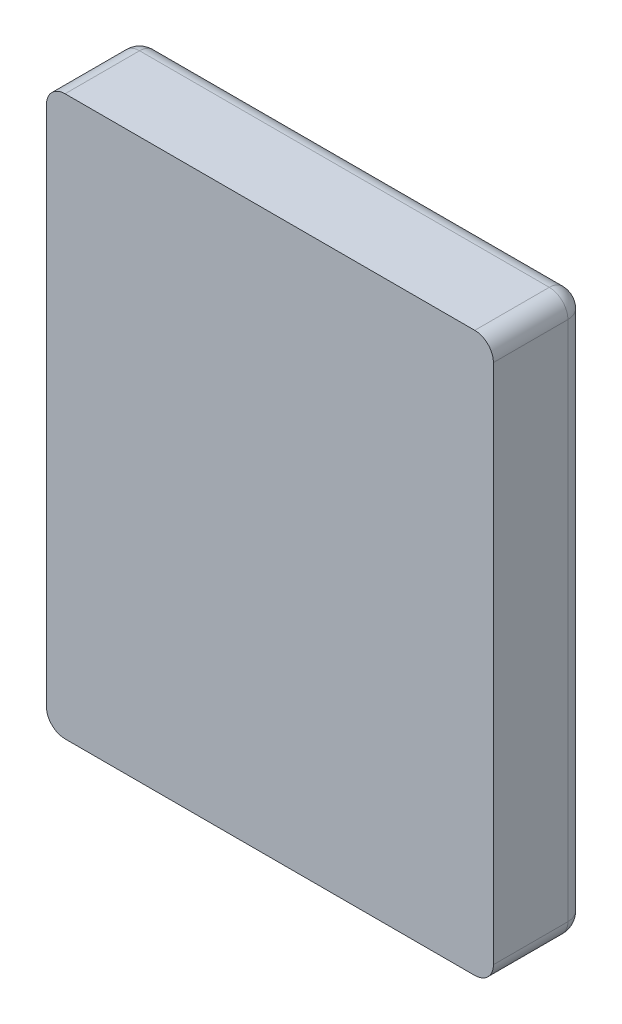
ISO-10303-21;
HEADER;
FILE_DESCRIPTION(('STEP AP214'),'2;1');
FILE_NAME('part.step','',(''),(''),'','','');
FILE_SCHEMA(('AUTOMOTIVE_DESIGN { 1 0 10303 214 1 1 1 1 }'));
ENDSEC;
DATA;
#1=APPLICATION_CONTEXT('core data for automotive mechanical design processes');
#2=APPLICATION_PROTOCOL_DEFINITION('international standard','automotive_design',2000,#1);
#3=PRODUCT_CONTEXT('',#1,'mechanical');
#4=PRODUCT('Part','Part','',(#3));
#5=PRODUCT_RELATED_PRODUCT_CATEGORY('part','',(#4));
#6=PRODUCT_DEFINITION_FORMATION('','',#4);
#7=PRODUCT_DEFINITION_CONTEXT('part definition',#1,'design');
#8=PRODUCT_DEFINITION('design','',#6,#7);
#9=PRODUCT_DEFINITION_SHAPE('','',#8);
#10=(LENGTH_UNIT() NAMED_UNIT(*) SI_UNIT(.MILLI.,.METRE.));
#11=(NAMED_UNIT(*) PLANE_ANGLE_UNIT() SI_UNIT($,.RADIAN.));
#12=(NAMED_UNIT(*) SI_UNIT($,.STERADIAN.) SOLID_ANGLE_UNIT());
#13=UNCERTAINTY_MEASURE_WITH_UNIT(LENGTH_MEASURE(1.E-05),#10,'distance_accuracy_value','');
#14=(GEOMETRIC_REPRESENTATION_CONTEXT(3) GLOBAL_UNCERTAINTY_ASSIGNED_CONTEXT((#13)) GLOBAL_UNIT_ASSIGNED_CONTEXT((#10,
#11,#12)) REPRESENTATION_CONTEXT('',''));
#15=CARTESIAN_POINT('',(0.,0.,0.));
#16=DIRECTION('',(0.,0.,1.));
#17=DIRECTION('',(1.,0.,0.));
#18=AXIS2_PLACEMENT_3D('',#15,#16,#17);
#19=CARTESIAN_POINT('',(-4.7,19.2,-2.));
#20=DIRECTION('',(1.,0.,0.));
#21=DIRECTION('',(0.,1.,0.));
#22=AXIS2_PLACEMENT_3D('',#19,#20,#21);
#23=SPHERICAL_SURFACE('',#22,0.5);
#24=CARTESIAN_POINT('',(-4.7,19.2,-2.));
#25=DIRECTION('',(1.,0.,0.));
#26=DIRECTION('',(0.,1.,0.));
#27=AXIS2_PLACEMENT_3D('',#24,#25,#26);
#28=CIRCLE('',#27,0.5);
#29=CARTESIAN_POINT('',(-4.7,19.2,-2.5));
#30=VERTEX_POINT('',#29);
#31=CARTESIAN_POINT('',(-4.7,19.7,-2.));
#32=VERTEX_POINT('',#31);
#33=EDGE_CURVE('E104',#30,#32,#28,.T.);
#34=ORIENTED_EDGE('',*,*,#33,.F.);
#35=CARTESIAN_POINT('',(-4.7,19.2,-2.));
#36=DIRECTION('',(0.,1.,0.));
#37=DIRECTION('',(-1.,0.,0.));
#38=AXIS2_PLACEMENT_3D('',#35,#36,#37);
#39=CIRCLE('',#38,0.5);
#40=CARTESIAN_POINT('',(-5.2,19.2,-2.));
#41=VERTEX_POINT('',#40);
#42=EDGE_CURVE('E106',#41,#30,#39,.F.);
#43=ORIENTED_EDGE('',*,*,#42,.F.);
#44=CARTESIAN_POINT('',(-4.7,19.2,-2.));
#45=DIRECTION('',(0.,0.,1.));
#46=DIRECTION('',(1.,0.,0.));
#47=AXIS2_PLACEMENT_3D('',#44,#45,#46);
#48=CIRCLE('',#47,0.5);
#49=EDGE_CURVE('E108',#32,#41,#48,.T.);
#50=ORIENTED_EDGE('',*,*,#49,.F.);
#51=EDGE_LOOP('',(#34,#43,#50));
#52=FACE_BOUND('',#51,.T.);
#53=ADVANCED_FACE('F17',(#52),#23,.T.);
#54=CARTESIAN_POINT('',(-4.7,5.2,-2.));
#55=DIRECTION('',(1.,0.,0.));
#56=DIRECTION('',(0.,1.,0.));
#57=AXIS2_PLACEMENT_3D('',#54,#55,#56);
#58=SPHERICAL_SURFACE('',#57,0.5);
#59=CARTESIAN_POINT('',(-4.69999999999999,5.2,-2.));
#60=DIRECTION('',(0.,1.,0.));
#61=DIRECTION('',(-1.,0.,0.));
#62=AXIS2_PLACEMENT_3D('',#59,#60,#61);
#63=CIRCLE('',#62,0.5);
#64=CARTESIAN_POINT('',(-4.7,5.2,-2.5));
#65=VERTEX_POINT('',#64);
#66=CARTESIAN_POINT('',(-5.2,5.2,-2.));
#67=VERTEX_POINT('',#66);
#68=EDGE_CURVE('E133',#65,#67,#63,.T.);
#69=ORIENTED_EDGE('',*,*,#68,.F.);
#70=CARTESIAN_POINT('',(-4.7,5.2,-2.));
#71=DIRECTION('',(-1.,0.,0.));
#72=DIRECTION('',(0.,-1.,0.));
#73=AXIS2_PLACEMENT_3D('',#70,#71,#72);
#74=CIRCLE('',#73,0.5);
#75=CARTESIAN_POINT('',(-4.7,4.7,-2.));
#76=VERTEX_POINT('',#75);
#77=EDGE_CURVE('E156',#76,#65,#74,.F.);
#78=ORIENTED_EDGE('',*,*,#77,.F.);
#79=CARTESIAN_POINT('',(-4.7,5.2,-2.));
#80=DIRECTION('',(0.,0.,1.));
#81=DIRECTION('',(1.,0.,0.));
#82=AXIS2_PLACEMENT_3D('',#79,#80,#81);
#83=CIRCLE('',#82,0.5);
#84=EDGE_CURVE('E150',#67,#76,#83,.T.);
#85=ORIENTED_EDGE('',*,*,#84,.F.);
#86=EDGE_LOOP('',(#69,#78,#85));
#87=FACE_BOUND('',#86,.T.);
#88=ADVANCED_FACE('F194',(#87),#58,.T.);
#89=CARTESIAN_POINT('',(6.3,5.2,-2.));
#90=DIRECTION('',(1.,0.,0.));
#91=DIRECTION('',(0.,1.,0.));
#92=AXIS2_PLACEMENT_3D('',#89,#90,#91);
#93=SPHERICAL_SURFACE('',#92,0.5);
#94=CARTESIAN_POINT('',(6.3,5.2,-2.));
#95=DIRECTION('',(0.,0.,1.));
#96=DIRECTION('',(1.,0.,0.));
#97=AXIS2_PLACEMENT_3D('',#94,#95,#96);
#98=CIRCLE('',#97,0.5);
#99=CARTESIAN_POINT('',(6.3,4.7,-2.));
#100=VERTEX_POINT('',#99);
#101=CARTESIAN_POINT('',(6.8,5.2,-2.));
#102=VERTEX_POINT('',#101);
#103=EDGE_CURVE('E147',#100,#102,#98,.T.);
#104=ORIENTED_EDGE('',*,*,#103,.F.);
#105=CARTESIAN_POINT('',(6.3,5.2,-2.));
#106=DIRECTION('',(-1.,0.,0.));
#107=DIRECTION('',(0.,-1.,0.));
#108=AXIS2_PLACEMENT_3D('',#105,#106,#107);
#109=CIRCLE('',#108,0.5);
#110=CARTESIAN_POINT('',(6.3,5.2,-2.5));
#111=VERTEX_POINT('',#110);
#112=EDGE_CURVE('E148',#111,#100,#109,.T.);
#113=ORIENTED_EDGE('',*,*,#112,.F.);
#114=CARTESIAN_POINT('',(6.3,5.2,-2.));
#115=DIRECTION('',(0.,-1.,0.));
#116=DIRECTION('',(1.,0.,0.));
#117=AXIS2_PLACEMENT_3D('',#114,#115,#116);
#118=CIRCLE('',#117,0.5);
#119=EDGE_CURVE('E206',#102,#111,#118,.F.);
#120=ORIENTED_EDGE('',*,*,#119,.F.);
#121=EDGE_LOOP('',(#104,#113,#120));
#122=FACE_BOUND('',#121,.T.);
#123=ADVANCED_FACE('F192',(#122),#93,.T.);
#124=CARTESIAN_POINT('',(0.,0.,-2.5));
#125=DIRECTION('',(0.,0.,1.));
#126=DIRECTION('',(1.,0.,0.));
#127=AXIS2_PLACEMENT_3D('',#124,#125,#126);
#128=PLANE('',#127);
#129=DIRECTION('',(-1.,0.,0.));
#130=VECTOR('',#129,1.);
#131=CARTESIAN_POINT('',(-5.2,5.2,-2.5));
#132=LINE('',#131,#130);
#133=EDGE_CURVE('E132',#65,#111,#132,.F.);
#134=ORIENTED_EDGE('',*,*,#133,.F.);
#135=DIRECTION('',(0.,1.,0.));
#136=VECTOR('',#135,1.);
#137=CARTESIAN_POINT('',(-4.7,19.7,-2.5));
#138=LINE('',#137,#136);
#139=EDGE_CURVE('E120',#30,#65,#138,.F.);
#140=ORIENTED_EDGE('',*,*,#139,.F.);
#141=DIRECTION('',(1.,0.,0.));
#142=VECTOR('',#141,1.);
#143=CARTESIAN_POINT('',(6.8,19.2,-2.5));
#144=LINE('',#143,#142);
#145=CARTESIAN_POINT('',(6.3,19.2,-2.5));
#146=VERTEX_POINT('',#145);
#147=EDGE_CURVE('E129',#146,#30,#144,.F.);
#148=ORIENTED_EDGE('',*,*,#147,.F.);
#149=DIRECTION('',(0.,-1.,0.));
#150=VECTOR('',#149,1.);
#151=CARTESIAN_POINT('',(6.3,4.7,-2.5));
#152=LINE('',#151,#150);
#153=EDGE_CURVE('E145',#111,#146,#152,.F.);
#154=ORIENTED_EDGE('',*,*,#153,.F.);
#155=EDGE_LOOP('',(#134,#140,#148,#154));
#156=FACE_BOUND('',#155,.T.);
#157=ADVANCED_FACE('F127',(#156),#128,.F.);
#158=CARTESIAN_POINT('',(6.3,19.2,-2.));
#159=DIRECTION('',(1.,0.,0.));
#160=DIRECTION('',(0.,1.,0.));
#161=AXIS2_PLACEMENT_3D('',#158,#159,#160);
#162=SPHERICAL_SURFACE('',#161,0.5);
#163=CARTESIAN_POINT('',(6.3,19.2,-2.));
#164=DIRECTION('',(0.,0.,1.));
#165=DIRECTION('',(1.,0.,0.));
#166=AXIS2_PLACEMENT_3D('',#163,#164,#165);
#167=CIRCLE('',#166,0.5);
#168=CARTESIAN_POINT('',(6.8,19.2,-2.));
#169=VERTEX_POINT('',#168);
#170=CARTESIAN_POINT('',(6.3,19.7,-2.));
#171=VERTEX_POINT('',#170);
#172=EDGE_CURVE('E70',#169,#171,#167,.T.);
#173=ORIENTED_EDGE('',*,*,#172,.F.);
#174=CARTESIAN_POINT('',(6.3,19.2,-2.));
#175=DIRECTION('',(0.,-1.,0.));
#176=DIRECTION('',(1.,0.,0.));
#177=AXIS2_PLACEMENT_3D('',#174,#175,#176);
#178=CIRCLE('',#177,0.5);
#179=EDGE_CURVE('E209',#146,#169,#178,.T.);
#180=ORIENTED_EDGE('',*,*,#179,.F.);
#181=CARTESIAN_POINT('',(6.3,19.2,-2.));
#182=DIRECTION('',(1.,0.,0.));
#183=DIRECTION('',(0.,1.,0.));
#184=AXIS2_PLACEMENT_3D('',#181,#182,#183);
#185=CIRCLE('',#184,0.5);
#186=EDGE_CURVE('E112',#171,#146,#185,.F.);
#187=ORIENTED_EDGE('',*,*,#186,.F.);
#188=EDGE_LOOP('',(#173,#180,#187));
#189=FACE_BOUND('',#188,.T.);
#190=ADVANCED_FACE('F185',(#189),#162,.T.);
#191=CARTESIAN_POINT('',(6.8,19.2,-2.));
#192=DIRECTION('',(1.,0.,0.));
#193=DIRECTION('',(0.,1.,0.));
#194=AXIS2_PLACEMENT_3D('',#191,#192,#193);
#195=CYLINDRICAL_SURFACE('',#194,0.5);
#196=ORIENTED_EDGE('',*,*,#186,.T.);
#197=ORIENTED_EDGE('',*,*,#147,.T.);
#198=ORIENTED_EDGE('',*,*,#33,.T.);
#199=DIRECTION('',(-1.,0.,0.));
#200=VECTOR('',#199,1.);
#201=CARTESIAN_POINT('',(6.8,19.7,-2.));
#202=LINE('',#201,#200);
#203=EDGE_CURVE('E170',#171,#32,#202,.T.);
#204=ORIENTED_EDGE('',*,*,#203,.F.);
#205=EDGE_LOOP('',(#196,#197,#198,#204));
#206=FACE_BOUND('',#205,.T.);
#207=ADVANCED_FACE('F136',(#206),#195,.T.);
#208=CARTESIAN_POINT('',(-4.7,19.2,-2.5));
#209=DIRECTION('',(0.,0.,1.));
#210=DIRECTION('',(1.,0.,0.));
#211=AXIS2_PLACEMENT_3D('',#208,#209,#210);
#212=CYLINDRICAL_SURFACE('',#211,0.5);
#213=ORIENTED_EDGE('',*,*,#49,.T.);
#214=DIRECTION('',(0.,0.,1.));
#215=VECTOR('',#214,1.);
#216=CARTESIAN_POINT('',(-5.2,19.2,-2.5));
#217=LINE('',#216,#215);
#218=CARTESIAN_POINT('',(-5.2,19.2,0.));
#219=VERTEX_POINT('',#218);
#220=EDGE_CURVE('E239',#219,#41,#217,.F.);
#221=ORIENTED_EDGE('',*,*,#220,.F.);
#222=CARTESIAN_POINT('',(-4.7,19.2,0.));
#223=DIRECTION('',(0.,0.,1.));
#224=DIRECTION('',(1.,0.,0.));
#225=AXIS2_PLACEMENT_3D('',#222,#223,#224);
#226=CIRCLE('',#225,0.5);
#227=CARTESIAN_POINT('',(-4.7,19.7,0.));
#228=VERTEX_POINT('',#227);
#229=EDGE_CURVE('E21',#219,#228,#226,.F.);
#230=ORIENTED_EDGE('',*,*,#229,.T.);
#231=DIRECTION('',(0.,0.,1.));
#232=VECTOR('',#231,1.);
#233=CARTESIAN_POINT('',(-4.7,19.7,-2.5));
#234=LINE('',#233,#232);
#235=EDGE_CURVE('E173',#32,#228,#234,.T.);
#236=ORIENTED_EDGE('',*,*,#235,.F.);
#237=EDGE_LOOP('',(#213,#221,#230,#236));
#238=FACE_BOUND('',#237,.T.);
#239=ADVANCED_FACE('F304',(#238),#212,.T.);
#240=CARTESIAN_POINT('',(-4.7,19.7,-2.));
#241=DIRECTION('',(0.,1.,0.));
#242=DIRECTION('',(-1.,0.,0.));
#243=AXIS2_PLACEMENT_3D('',#240,#241,#242);
#244=CYLINDRICAL_SURFACE('',#243,0.5);
#245=ORIENTED_EDGE('',*,*,#68,.T.);
#246=DIRECTION('',(0.,-1.,0.));
#247=VECTOR('',#246,1.);
#248=CARTESIAN_POINT('',(-5.2,19.7,-2.));
#249=LINE('',#248,#247);
#250=EDGE_CURVE('E122',#41,#67,#249,.T.);
#251=ORIENTED_EDGE('',*,*,#250,.F.);
#252=ORIENTED_EDGE('',*,*,#42,.T.);
#253=ORIENTED_EDGE('',*,*,#139,.T.);
#254=EDGE_LOOP('',(#245,#251,#252,#253));
#255=FACE_BOUND('',#254,.T.);
#256=ADVANCED_FACE('F119',(#255),#244,.T.);
#257=CARTESIAN_POINT('',(-4.7,5.2,-2.5));
#258=DIRECTION('',(0.,0.,1.));
#259=DIRECTION('',(1.,0.,0.));
#260=AXIS2_PLACEMENT_3D('',#257,#258,#259);
#261=CYLINDRICAL_SURFACE('',#260,0.5);
#262=ORIENTED_EDGE('',*,*,#84,.T.);
#263=DIRECTION('',(0.,0.,1.));
#264=VECTOR('',#263,1.);
#265=CARTESIAN_POINT('',(-4.7,4.7,-2.5));
#266=LINE('',#265,#264);
#267=CARTESIAN_POINT('',(-4.7,4.7,0.));
#268=VERTEX_POINT('',#267);
#269=EDGE_CURVE('E226',#268,#76,#266,.F.);
#270=ORIENTED_EDGE('',*,*,#269,.F.);
#271=CARTESIAN_POINT('',(-4.7,5.2,0.));
#272=DIRECTION('',(0.,0.,1.));
#273=DIRECTION('',(1.,0.,0.));
#274=AXIS2_PLACEMENT_3D('',#271,#272,#273);
#275=CIRCLE('',#274,0.5);
#276=CARTESIAN_POINT('',(-5.2,5.2,0.));
#277=VERTEX_POINT('',#276);
#278=EDGE_CURVE('E149',#268,#277,#275,.F.);
#279=ORIENTED_EDGE('',*,*,#278,.T.);
#280=DIRECTION('',(0.,0.,1.));
#281=VECTOR('',#280,1.);
#282=CARTESIAN_POINT('',(-5.19999999999999,5.2,-2.5));
#283=LINE('',#282,#281);
#284=EDGE_CURVE('E238',#67,#277,#283,.T.);
#285=ORIENTED_EDGE('',*,*,#284,.F.);
#286=EDGE_LOOP('',(#262,#270,#279,#285));
#287=FACE_BOUND('',#286,.T.);
#288=ADVANCED_FACE('F292',(#287),#261,.T.);
#289=CARTESIAN_POINT('',(-5.2,5.2,-2.));
#290=DIRECTION('',(-1.,0.,0.));
#291=DIRECTION('',(0.,-1.,0.));
#292=AXIS2_PLACEMENT_3D('',#289,#290,#291);
#293=CYLINDRICAL_SURFACE('',#292,0.5);
#294=ORIENTED_EDGE('',*,*,#112,.T.);
#295=DIRECTION('',(1.,0.,0.));
#296=VECTOR('',#295,1.);
#297=CARTESIAN_POINT('',(-5.2,4.7,-2.));
#298=LINE('',#297,#296);
#299=EDGE_CURVE('E222',#76,#100,#298,.T.);
#300=ORIENTED_EDGE('',*,*,#299,.F.);
#301=ORIENTED_EDGE('',*,*,#77,.T.);
#302=ORIENTED_EDGE('',*,*,#133,.T.);
#303=EDGE_LOOP('',(#294,#300,#301,#302));
#304=FACE_BOUND('',#303,.T.);
#305=ADVANCED_FACE('F294',(#304),#293,.T.);
#306=CARTESIAN_POINT('',(6.3,5.2,-2.5));
#307=DIRECTION('',(0.,0.,1.));
#308=DIRECTION('',(1.,0.,0.));
#309=AXIS2_PLACEMENT_3D('',#306,#307,#308);
#310=CYLINDRICAL_SURFACE('',#309,0.5);
#311=ORIENTED_EDGE('',*,*,#103,.T.);
#312=DIRECTION('',(0.,0.,1.));
#313=VECTOR('',#312,1.);
#314=CARTESIAN_POINT('',(6.8,5.2,-2.5));
#315=LINE('',#314,#313);
#316=CARTESIAN_POINT('',(6.8,5.2,0.));
#317=VERTEX_POINT('',#316);
#318=EDGE_CURVE('E267',#317,#102,#315,.F.);
#319=ORIENTED_EDGE('',*,*,#318,.F.);
#320=CARTESIAN_POINT('',(6.3,5.2,0.));
#321=DIRECTION('',(0.,0.,1.));
#322=DIRECTION('',(1.,0.,0.));
#323=AXIS2_PLACEMENT_3D('',#320,#321,#322);
#324=CIRCLE('',#323,0.5);
#325=CARTESIAN_POINT('',(6.3,4.7,0.));
#326=VERTEX_POINT('',#325);
#327=EDGE_CURVE('E146',#317,#326,#324,.F.);
#328=ORIENTED_EDGE('',*,*,#327,.T.);
#329=DIRECTION('',(0.,0.,1.));
#330=VECTOR('',#329,1.);
#331=CARTESIAN_POINT('',(6.3,4.7,-2.5));
#332=LINE('',#331,#330);
#333=EDGE_CURVE('E225',#100,#326,#332,.T.);
#334=ORIENTED_EDGE('',*,*,#333,.F.);
#335=EDGE_LOOP('',(#311,#319,#328,#334));
#336=FACE_BOUND('',#335,.T.);
#337=ADVANCED_FACE('F297',(#336),#310,.T.);
#338=CARTESIAN_POINT('',(6.3,4.7,-2.));
#339=DIRECTION('',(0.,-1.,0.));
#340=DIRECTION('',(1.,0.,0.));
#341=AXIS2_PLACEMENT_3D('',#338,#339,#340);
#342=CYLINDRICAL_SURFACE('',#341,0.5);
#343=ORIENTED_EDGE('',*,*,#119,.T.);
#344=ORIENTED_EDGE('',*,*,#153,.T.);
#345=ORIENTED_EDGE('',*,*,#179,.T.);
#346=DIRECTION('',(0.,1.,0.));
#347=VECTOR('',#346,1.);
#348=CARTESIAN_POINT('',(6.8,4.7,-2.));
#349=LINE('',#348,#347);
#350=EDGE_CURVE('E263',#102,#169,#349,.T.);
#351=ORIENTED_EDGE('',*,*,#350,.F.);
#352=EDGE_LOOP('',(#343,#344,#345,#351));
#353=FACE_BOUND('',#352,.T.);
#354=ADVANCED_FACE('F353',(#353),#342,.T.);
#355=CARTESIAN_POINT('',(6.3,19.2,-2.5));
#356=DIRECTION('',(0.,0.,1.));
#357=DIRECTION('',(1.,0.,0.));
#358=AXIS2_PLACEMENT_3D('',#355,#356,#357);
#359=CYLINDRICAL_SURFACE('',#358,0.5);
#360=ORIENTED_EDGE('',*,*,#172,.T.);
#361=DIRECTION('',(0.,0.,1.));
#362=VECTOR('',#361,1.);
#363=CARTESIAN_POINT('',(6.3,19.7,-2.5));
#364=LINE('',#363,#362);
#365=CARTESIAN_POINT('',(6.3,19.7,0.));
#366=VERTEX_POINT('',#365);
#367=EDGE_CURVE('E242',#366,#171,#364,.F.);
#368=ORIENTED_EDGE('',*,*,#367,.F.);
#369=CARTESIAN_POINT('',(6.3,19.2,0.));
#370=DIRECTION('',(0.,0.,1.));
#371=DIRECTION('',(1.,0.,0.));
#372=AXIS2_PLACEMENT_3D('',#369,#370,#371);
#373=CIRCLE('',#372,0.5);
#374=CARTESIAN_POINT('',(6.8,19.2,0.));
#375=VERTEX_POINT('',#374);
#376=EDGE_CURVE('E36',#366,#375,#373,.F.);
#377=ORIENTED_EDGE('',*,*,#376,.T.);
#378=DIRECTION('',(0.,0.,1.));
#379=VECTOR('',#378,1.);
#380=CARTESIAN_POINT('',(6.8,19.2,-2.5));
#381=LINE('',#380,#379);
#382=EDGE_CURVE('E266',#169,#375,#381,.T.);
#383=ORIENTED_EDGE('',*,*,#382,.F.);
#384=EDGE_LOOP('',(#360,#368,#377,#383));
#385=FACE_BOUND('',#384,.T.);
#386=ADVANCED_FACE('F315',(#385),#359,.T.);
#387=CARTESIAN_POINT('',(6.8,19.7,-2.5));
#388=DIRECTION('',(0.,1.,0.));
#389=DIRECTION('',(-1.,0.,0.));
#390=AXIS2_PLACEMENT_3D('',#387,#388,#389);
#391=PLANE('',#390);
#392=DIRECTION('',(1.,0.,0.));
#393=VECTOR('',#392,1.);
#394=CARTESIAN_POINT('',(0.,19.7,0.));
#395=LINE('',#394,#393);
#396=EDGE_CURVE('E271',#366,#228,#395,.F.);
#397=ORIENTED_EDGE('',*,*,#396,.F.);
#398=ORIENTED_EDGE('',*,*,#367,.T.);
#399=ORIENTED_EDGE('',*,*,#203,.T.);
#400=ORIENTED_EDGE('',*,*,#235,.T.);
#401=EDGE_LOOP('',(#397,#398,#399,#400));
#402=FACE_BOUND('',#401,.T.);
#403=ADVANCED_FACE('F303',(#402),#391,.T.);
#404=CARTESIAN_POINT('',(-5.2,19.7,-2.5));
#405=DIRECTION('',(-1.,0.,0.));
#406=DIRECTION('',(0.,-1.,0.));
#407=AXIS2_PLACEMENT_3D('',#404,#405,#406);
#408=PLANE('',#407);
#409=ORIENTED_EDGE('',*,*,#250,.T.);
#410=ORIENTED_EDGE('',*,*,#284,.T.);
#411=DIRECTION('',(0.,1.,0.));
#412=VECTOR('',#411,1.);
#413=CARTESIAN_POINT('',(-5.2,0.,0.));
#414=LINE('',#413,#412);
#415=EDGE_CURVE('E299',#219,#277,#414,.F.);
#416=ORIENTED_EDGE('',*,*,#415,.F.);
#417=ORIENTED_EDGE('',*,*,#220,.T.);
#418=EDGE_LOOP('',(#409,#410,#416,#417));
#419=FACE_BOUND('',#418,.T.);
#420=ADVANCED_FACE('F305',(#419),#408,.T.);
#421=CARTESIAN_POINT('',(-5.2,4.7,-2.5));
#422=DIRECTION('',(0.,-1.,0.));
#423=DIRECTION('',(1.,0.,0.));
#424=AXIS2_PLACEMENT_3D('',#421,#422,#423);
#425=PLANE('',#424);
#426=ORIENTED_EDGE('',*,*,#299,.T.);
#427=ORIENTED_EDGE('',*,*,#333,.T.);
#428=DIRECTION('',(1.,0.,0.));
#429=VECTOR('',#428,1.);
#430=CARTESIAN_POINT('',(0.,4.7,0.));
#431=LINE('',#430,#429);
#432=EDGE_CURVE('E27',#268,#326,#431,.T.);
#433=ORIENTED_EDGE('',*,*,#432,.F.);
#434=ORIENTED_EDGE('',*,*,#269,.T.);
#435=EDGE_LOOP('',(#426,#427,#433,#434));
#436=FACE_BOUND('',#435,.T.);
#437=ADVANCED_FACE('F289',(#436),#425,.T.);
#438=CARTESIAN_POINT('',(6.8,4.7,-2.5));
#439=DIRECTION('',(1.,0.,0.));
#440=DIRECTION('',(0.,1.,0.));
#441=AXIS2_PLACEMENT_3D('',#438,#439,#440);
#442=PLANE('',#441);
#443=ORIENTED_EDGE('',*,*,#350,.T.);
#444=ORIENTED_EDGE('',*,*,#382,.T.);
#445=DIRECTION('',(0.,1.,0.));
#446=VECTOR('',#445,1.);
#447=CARTESIAN_POINT('',(6.8,0.,0.));
#448=LINE('',#447,#446);
#449=EDGE_CURVE('E11',#317,#375,#448,.T.);
#450=ORIENTED_EDGE('',*,*,#449,.F.);
#451=ORIENTED_EDGE('',*,*,#318,.T.);
#452=EDGE_LOOP('',(#443,#444,#450,#451));
#453=FACE_BOUND('',#452,.T.);
#454=ADVANCED_FACE('F313',(#453),#442,.T.);
#455=CARTESIAN_POINT('',(0.,0.,0.));
#456=DIRECTION('',(0.,0.,1.));
#457=DIRECTION('',(1.,0.,0.));
#458=AXIS2_PLACEMENT_3D('',#455,#456,#457);
#459=PLANE('',#458);
#460=ORIENTED_EDGE('',*,*,#449,.T.);
#461=ORIENTED_EDGE('',*,*,#376,.F.);
#462=ORIENTED_EDGE('',*,*,#396,.T.);
#463=ORIENTED_EDGE('',*,*,#229,.F.);
#464=ORIENTED_EDGE('',*,*,#415,.T.);
#465=ORIENTED_EDGE('',*,*,#278,.F.);
#466=ORIENTED_EDGE('',*,*,#432,.T.);
#467=ORIENTED_EDGE('',*,*,#327,.F.);
#468=EDGE_LOOP('',(#460,#461,#462,#463,#464,#465,#466,#467));
#469=FACE_BOUND('',#468,.T.);
#470=ADVANCED_FACE('F298',(#469),#459,.T.);
#471=CLOSED_SHELL('',(#53,#88,#123,#157,#190,#207,#239,#256,#288,#305,#337,#354,#386,#403,#420,
#437,#454,#470));
#472=MANIFOLD_SOLID_BREP('B1',#471);
#473=ADVANCED_BREP_SHAPE_REPRESENTATION('',(#18,#472),#14);
#474=SHAPE_DEFINITION_REPRESENTATION(#9,#473);
ENDSEC;
END-ISO-10303-21;
